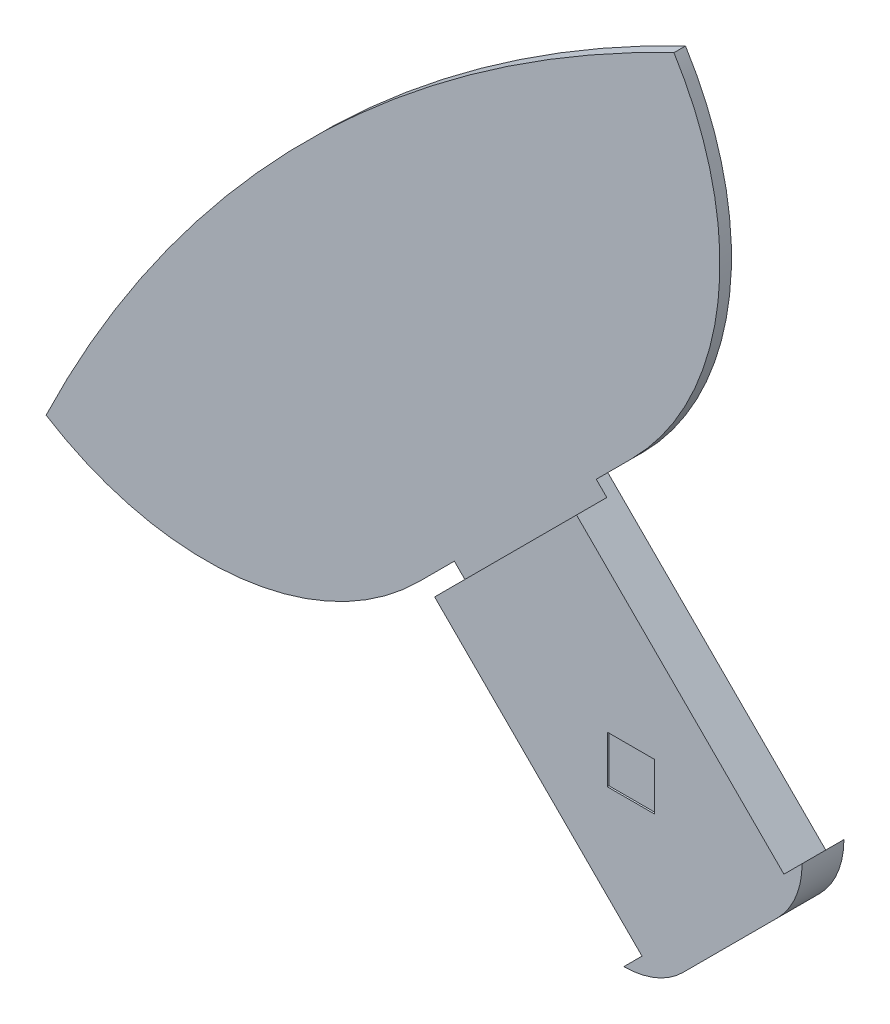
ISO-10303-21;
HEADER;
FILE_DESCRIPTION(('STEP AP214'),'2;1');
FILE_NAME('part.step','',(''),(''),'','','');
FILE_SCHEMA(('AUTOMOTIVE_DESIGN { 1 0 10303 214 1 1 1 1 }'));
ENDSEC;
DATA;
#1=APPLICATION_CONTEXT('core data for automotive mechanical design processes');
#2=APPLICATION_PROTOCOL_DEFINITION('international standard','automotive_design',2000,#1);
#3=PRODUCT_CONTEXT('',#1,'mechanical');
#4=PRODUCT('Part','Part','',(#3));
#5=PRODUCT_RELATED_PRODUCT_CATEGORY('part','',(#4));
#6=PRODUCT_DEFINITION_FORMATION('','',#4);
#7=PRODUCT_DEFINITION_CONTEXT('part definition',#1,'design');
#8=PRODUCT_DEFINITION('design','',#6,#7);
#9=PRODUCT_DEFINITION_SHAPE('','',#8);
#10=(LENGTH_UNIT() NAMED_UNIT(*) SI_UNIT(.MILLI.,.METRE.));
#11=(NAMED_UNIT(*) PLANE_ANGLE_UNIT() SI_UNIT($,.RADIAN.));
#12=(NAMED_UNIT(*) SI_UNIT($,.STERADIAN.) SOLID_ANGLE_UNIT());
#13=UNCERTAINTY_MEASURE_WITH_UNIT(LENGTH_MEASURE(1.E-05),#10,'distance_accuracy_value','');
#14=(GEOMETRIC_REPRESENTATION_CONTEXT(3) GLOBAL_UNCERTAINTY_ASSIGNED_CONTEXT((#13)) GLOBAL_UNIT_ASSIGNED_CONTEXT((#10,
#11,#12)) REPRESENTATION_CONTEXT('',''));
#15=CARTESIAN_POINT('',(0.,0.,0.));
#16=DIRECTION('',(0.,0.,1.));
#17=DIRECTION('',(1.,0.,0.));
#18=AXIS2_PLACEMENT_3D('',#15,#16,#17);
#19=CARTESIAN_POINT('',(-43.4815077525087,43.4815077525089,5.));
#20=DIRECTION('',(0.707106781186545,-0.70710678118655,0.));
#21=DIRECTION('',(0.70710678118655,0.707106781186545,0.));
#22=AXIS2_PLACEMENT_3D('',#19,#20,#21);
#23=PLANE('',#22);
#24=DIRECTION('',(0.,0.,-1.));
#25=VECTOR('',#24,1.);
#26=CARTESIAN_POINT('',(-37.1175467218298,49.8454687831878,5.));
#27=LINE('',#26,#25);
#28=CARTESIAN_POINT('',(-37.1175467218298,49.8454687831878,0.689999999999997));
#29=VERTEX_POINT('',#28);
#30=CARTESIAN_POINT('',(-37.1175467218298,49.8454687831878,0.));
#31=VERTEX_POINT('',#30);
#32=EDGE_CURVE('E287',#29,#31,#27,.T.);
#33=ORIENTED_EDGE('',*,*,#32,.F.);
#34=DIRECTION('',(0.707106781186553,0.707106781186542,0.));
#35=VECTOR('',#34,1.);
#36=CARTESIAN_POINT('',(-37.1175467218298,49.8454687831878,0.689999999999997));
#37=LINE('',#36,#35);
#38=CARTESIAN_POINT('',(-39.2388670653894,47.7241484396281,0.689999999999997));
#39=VERTEX_POINT('',#38);
#40=EDGE_CURVE('E203',#39,#29,#37,.T.);
#41=ORIENTED_EDGE('',*,*,#40,.F.);
#42=DIRECTION('',(0.,0.,-1.));
#43=VECTOR('',#42,1.);
#44=CARTESIAN_POINT('',(-39.2388670653894,47.7241484396281,5.));
#45=LINE('',#44,#43);
#46=CARTESIAN_POINT('',(-39.2388670653894,47.7241484396281,0.));
#47=VERTEX_POINT('',#46);
#48=EDGE_CURVE('E289',#39,#47,#45,.T.);
#49=ORIENTED_EDGE('',*,*,#48,.T.);
#50=DIRECTION('',(-0.70710678118655,-0.707106781186545,0.));
#51=VECTOR('',#50,1.);
#52=CARTESIAN_POINT('',(-43.4815077525087,43.4815077525089,0.));
#53=LINE('',#52,#51);
#54=EDGE_CURVE('E238',#31,#47,#53,.T.);
#55=ORIENTED_EDGE('',*,*,#54,.F.);
#56=EDGE_LOOP('',(#33,#41,#49,#55));
#57=FACE_BOUND('',#56,.T.);
#58=ADVANCED_FACE('F39',(#57),#23,.T.);
#59=CARTESIAN_POINT('',(-49.8454687831876,62.5733908445456,5.));
#60=DIRECTION('',(0.,0.,-1.));
#61=DIRECTION('',(-1.,0.,0.));
#62=AXIS2_PLACEMENT_3D('',#59,#60,#61);
#63=CYLINDRICAL_SURFACE('',#62,18.);
#64=DIRECTION('',(0.,0.,-1.));
#65=VECTOR('',#64,1.);
#66=CARTESIAN_POINT('',(-34.5941198646809,72.1335349943983,5.));
#67=LINE('',#66,#65);
#68=CARTESIAN_POINT('',(-34.5941198646809,72.1335349943984,0.689999999999997));
#69=VERTEX_POINT('',#68);
#70=CARTESIAN_POINT('',(-34.5941198646809,72.1335349943983,0.));
#71=VERTEX_POINT('',#70);
#72=EDGE_CURVE('E285',#69,#71,#67,.T.);
#73=ORIENTED_EDGE('',*,*,#72,.F.);
#74=CARTESIAN_POINT('',(-49.8454687831876,62.5733908445456,0.689999999999997));
#75=DIRECTION('',(0.,0.,1.));
#76=DIRECTION('',(1.,0.,0.));
#77=AXIS2_PLACEMENT_3D('',#74,#75,#76);
#78=CIRCLE('',#77,18.);
#79=EDGE_CURVE('E205',#29,#69,#78,.T.);
#80=ORIENTED_EDGE('',*,*,#79,.F.);
#81=ORIENTED_EDGE('',*,*,#32,.T.);
#82=CARTESIAN_POINT('',(-49.8454687831876,62.5733908445456,0.));
#83=DIRECTION('',(0.,0.,1.));
#84=DIRECTION('',(1.,0.,0.));
#85=AXIS2_PLACEMENT_3D('',#82,#83,#84);
#86=CIRCLE('',#85,18.);
#87=EDGE_CURVE('E241',#71,#31,#86,.F.);
#88=ORIENTED_EDGE('',*,*,#87,.F.);
#89=EDGE_LOOP('',(#73,#80,#81,#88));
#90=FACE_BOUND('',#89,.T.);
#91=ADVANCED_FACE('F316',(#90),#63,.T.);
#92=CARTESIAN_POINT('',(-62.5733908445455,49.8454687831878,5.));
#93=DIRECTION('',(0.,0.,-1.));
#94=DIRECTION('',(-1.,0.,0.));
#95=AXIS2_PLACEMENT_3D('',#92,#93,#94);
#96=CYLINDRICAL_SURFACE('',#95,18.);
#97=DIRECTION('',(0.,0.,-1.));
#98=VECTOR('',#97,1.);
#99=CARTESIAN_POINT('',(-49.8454687831877,37.11754672183,5.));
#100=LINE('',#99,#98);
#101=CARTESIAN_POINT('',(-49.8454687831877,37.11754672183,0.689999999999997));
#102=VERTEX_POINT('',#101);
#103=CARTESIAN_POINT('',(-49.8454687831877,37.11754672183,0.));
#104=VERTEX_POINT('',#103);
#105=EDGE_CURVE('E281',#102,#104,#100,.T.);
#106=ORIENTED_EDGE('',*,*,#105,.F.);
#107=CARTESIAN_POINT('',(-62.5733908445455,49.8454687831878,0.689999999999997));
#108=DIRECTION('',(0.,0.,1.));
#109=DIRECTION('',(1.,0.,0.));
#110=AXIS2_PLACEMENT_3D('',#107,#108,#109);
#111=CIRCLE('',#110,18.);
#112=CARTESIAN_POINT('',(-72.1335349943982,34.5941198646812,0.689999999999997));
#113=VERTEX_POINT('',#112);
#114=EDGE_CURVE('E209',#113,#102,#111,.T.);
#115=ORIENTED_EDGE('',*,*,#114,.F.);
#116=DIRECTION('',(0.,0.,-1.));
#117=VECTOR('',#116,1.);
#118=CARTESIAN_POINT('',(-72.1335349943982,34.5941198646811,5.));
#119=LINE('',#118,#117);
#120=CARTESIAN_POINT('',(-72.1335349943982,34.5941198646811,0.));
#121=VERTEX_POINT('',#120);
#122=EDGE_CURVE('E283',#113,#121,#119,.T.);
#123=ORIENTED_EDGE('',*,*,#122,.T.);
#124=CARTESIAN_POINT('',(-62.5733908445455,49.8454687831878,0.));
#125=DIRECTION('',(0.,0.,1.));
#126=DIRECTION('',(1.,0.,0.));
#127=AXIS2_PLACEMENT_3D('',#124,#125,#126);
#128=CIRCLE('',#127,18.);
#129=EDGE_CURVE('E248',#104,#121,#128,.F.);
#130=ORIENTED_EDGE('',*,*,#129,.F.);
#131=EDGE_LOOP('',(#106,#115,#123,#130));
#132=FACE_BOUND('',#131,.T.);
#133=ADVANCED_FACE('F326',(#132),#96,.T.);
#134=DIRECTION('',(0.,0.,-1.));
#135=VECTOR('',#134,1.);
#136=CARTESIAN_POINT('',(-47.724148439628,39.2388670653896,5.));
#137=LINE('',#136,#135);
#138=CARTESIAN_POINT('',(-47.724148439628,39.2388670653896,0.689999999999997));
#139=VERTEX_POINT('',#138);
#140=CARTESIAN_POINT('',(-47.724148439628,39.2388670653896,0.));
#141=VERTEX_POINT('',#140);
#142=EDGE_CURVE('E279',#139,#141,#137,.T.);
#143=ORIENTED_EDGE('',*,*,#142,.F.);
#144=DIRECTION('',(0.707106781186549,0.707106781186546,0.));
#145=VECTOR('',#144,1.);
#146=CARTESIAN_POINT('',(-47.724148439628,39.2388670653896,0.689999999999997));
#147=LINE('',#146,#145);
#148=EDGE_CURVE('E211',#102,#139,#147,.T.);
#149=ORIENTED_EDGE('',*,*,#148,.F.);
#150=ORIENTED_EDGE('',*,*,#105,.T.);
#151=EDGE_CURVE('E242',#141,#104,#53,.T.);
#152=ORIENTED_EDGE('',*,*,#151,.F.);
#153=EDGE_LOOP('',(#143,#149,#150,#152));
#154=FACE_BOUND('',#153,.T.);
#155=ADVANCED_FACE('F329',(#154),#23,.T.);
#156=CARTESIAN_POINT('',(0.,0.,5.));
#157=DIRECTION('',(0.,0.,-1.));
#158=DIRECTION('',(-1.,0.,0.));
#159=AXIS2_PLACEMENT_3D('',#156,#157,#158);
#160=CYLINDRICAL_SURFACE('',#159,80.);
#161=CARTESIAN_POINT('',(0.,0.,0.689999999999997));
#162=DIRECTION('',(0.,0.,1.));
#163=DIRECTION('',(1.,0.,0.));
#164=AXIS2_PLACEMENT_3D('',#161,#162,#163);
#165=CIRCLE('',#164,80.);
#166=EDGE_CURVE('E207',#69,#113,#165,.T.);
#167=ORIENTED_EDGE('',*,*,#166,.F.);
#168=ORIENTED_EDGE('',*,*,#72,.T.);
#169=CARTESIAN_POINT('',(0.,0.,0.));
#170=DIRECTION('',(0.,0.,1.));
#171=DIRECTION('',(1.,0.,0.));
#172=AXIS2_PLACEMENT_3D('',#169,#170,#171);
#173=CIRCLE('',#172,80.);
#174=EDGE_CURVE('E245',#71,#121,#173,.T.);
#175=ORIENTED_EDGE('',*,*,#174,.T.);
#176=ORIENTED_EDGE('',*,*,#122,.F.);
#177=EDGE_LOOP('',(#167,#168,#175,#176));
#178=FACE_BOUND('',#177,.T.);
#179=ADVANCED_FACE('F321',(#178),#160,.T.);
#180=CARTESIAN_POINT('',(4.24264068711934,4.24264068711934,5.));
#181=DIRECTION('',(0.707106781186548,0.707106781186548,0.));
#182=DIRECTION('',(-0.707106781186548,0.707106781186548,0.));
#183=AXIS2_PLACEMENT_3D('',#180,#181,#182);
#184=PLANE('',#183);
#185=DIRECTION('',(-0.707106781186551,0.707106781186544,0.));
#186=VECTOR('',#185,1.);
#187=CARTESIAN_POINT('',(-39.2388670653894,47.7241484396281,0.689999999999997));
#188=LINE('',#187,#186);
#189=CARTESIAN_POINT('',(-38.6080302527855,47.0933116270241,0.689999999999997));
#190=VERTEX_POINT('',#189);
#191=EDGE_CURVE('E198',#190,#39,#188,.T.);
#192=ORIENTED_EDGE('',*,*,#191,.F.);
#193=DIRECTION('',(0.,0.,-1.));
#194=VECTOR('',#193,1.);
#195=CARTESIAN_POINT('',(-38.6080302527855,47.0933116270241,5.));
#196=LINE('',#195,#194);
#197=CARTESIAN_POINT('',(-38.6080302527855,47.0933116270241,2.5));
#198=VERTEX_POINT('',#197);
#199=EDGE_CURVE('E233',#198,#190,#196,.T.);
#200=ORIENTED_EDGE('',*,*,#199,.F.);
#201=DIRECTION('',(-0.707106781186548,0.707106781186548,0.));
#202=VECTOR('',#201,1.);
#203=CARTESIAN_POINT('',(4.24264068711934,4.24264068711934,2.5));
#204=LINE('',#203,#202);
#205=CARTESIAN_POINT('',(-26.2085353161738,34.6938166904125,2.5));
#206=VERTEX_POINT('',#205);
#207=EDGE_CURVE('E62',#206,#198,#204,.T.);
#208=ORIENTED_EDGE('',*,*,#207,.F.);
#209=DIRECTION('',(0.,0.,-1.));
#210=VECTOR('',#209,1.);
#211=CARTESIAN_POINT('',(-26.2085353161738,34.6938166904125,5.));
#212=LINE('',#211,#210);
#213=CARTESIAN_POINT('',(-26.2085353161738,34.6938166904125,0.));
#214=VERTEX_POINT('',#213);
#215=EDGE_CURVE('E267',#206,#214,#212,.T.);
#216=ORIENTED_EDGE('',*,*,#215,.T.);
#217=DIRECTION('',(0.707106781186548,-0.707106781186548,0.));
#218=VECTOR('',#217,1.);
#219=CARTESIAN_POINT('',(4.24264068711934,4.24264068711934,0.));
#220=LINE('',#219,#218);
#221=EDGE_CURVE('E235',#47,#214,#220,.T.);
#222=ORIENTED_EDGE('',*,*,#221,.F.);
#223=ORIENTED_EDGE('',*,*,#48,.F.);
#224=EDGE_LOOP('',(#192,#200,#208,#216,#222,#223));
#225=FACE_BOUND('',#224,.T.);
#226=ADVANCED_FACE('F41',(#225),#184,.T.);
#227=CARTESIAN_POINT('',(-4.2426406871192,-4.2426406871192,5.));
#228=DIRECTION('',(0.707106781186547,0.707106781186548,0.));
#229=DIRECTION('',(-0.707106781186548,0.707106781186547,0.));
#230=AXIS2_PLACEMENT_3D('',#227,#228,#229);
#231=PLANE('',#230);
#232=DIRECTION('',(0.,0.,-1.));
#233=VECTOR('',#232,1.);
#234=CARTESIAN_POINT('',(-47.093311627024,38.6080302527856,5.));
#235=LINE('',#234,#233);
#236=CARTESIAN_POINT('',(-47.093311627024,38.6080302527856,2.5));
#237=VERTEX_POINT('',#236);
#238=CARTESIAN_POINT('',(-47.093311627024,38.6080302527856,0.689999999999997));
#239=VERTEX_POINT('',#238);
#240=EDGE_CURVE('E47',#237,#239,#235,.T.);
#241=ORIENTED_EDGE('',*,*,#240,.T.);
#242=DIRECTION('',(0.707106781186544,-0.707106781186551,0.));
#243=VECTOR('',#242,1.);
#244=CARTESIAN_POINT('',(-47.724148439628,39.2388670653896,0.689999999999997));
#245=LINE('',#244,#243);
#246=EDGE_CURVE('E213',#139,#239,#245,.T.);
#247=ORIENTED_EDGE('',*,*,#246,.F.);
#248=ORIENTED_EDGE('',*,*,#142,.T.);
#249=DIRECTION('',(0.707106781186548,-0.707106781186547,0.));
#250=VECTOR('',#249,1.);
#251=CARTESIAN_POINT('',(-4.2426406871192,-4.2426406871192,0.));
#252=LINE('',#251,#250);
#253=CARTESIAN_POINT('',(-34.6938166904123,26.2085353161739,0.));
#254=VERTEX_POINT('',#253);
#255=EDGE_CURVE('E251',#141,#254,#252,.T.);
#256=ORIENTED_EDGE('',*,*,#255,.T.);
#257=DIRECTION('',(0.,0.,-1.));
#258=VECTOR('',#257,1.);
#259=CARTESIAN_POINT('',(-34.6938166904123,26.2085353161739,5.));
#260=LINE('',#259,#258);
#261=CARTESIAN_POINT('',(-34.6938166904123,26.2085353161739,2.5));
#262=VERTEX_POINT('',#261);
#263=EDGE_CURVE('E277',#262,#254,#260,.T.);
#264=ORIENTED_EDGE('',*,*,#263,.F.);
#265=DIRECTION('',(-0.707106781186548,0.707106781186547,0.));
#266=VECTOR('',#265,1.);
#267=CARTESIAN_POINT('',(-4.2426406871192,-4.2426406871192,2.5));
#268=LINE('',#267,#266);
#269=EDGE_CURVE('E219',#262,#237,#268,.T.);
#270=ORIENTED_EDGE('',*,*,#269,.T.);
#271=EDGE_LOOP('',(#241,#247,#248,#256,#264,#270));
#272=FACE_BOUND('',#271,.T.);
#273=ADVANCED_FACE('F293',(#272),#231,.F.);
#274=CARTESIAN_POINT('',(-30.4511760032931,30.4511760032932,5.));
#275=DIRECTION('',(-0.707106781186546,0.707106781186549,0.));
#276=DIRECTION('',(-0.707106781186549,-0.707106781186546,0.));
#277=AXIS2_PLACEMENT_3D('',#274,#275,#276);
#278=PLANE('',#277);
#279=DIRECTION('',(-0.707106781186549,-0.707106781186546,0.));
#280=VECTOR('',#279,1.);
#281=CARTESIAN_POINT('',(-30.4511760032931,30.4511760032932,2.5));
#282=LINE('',#281,#280);
#283=CARTESIAN_POINT('',(-35.7796031280393,25.122748878547,2.5));
#284=VERTEX_POINT('',#283);
#285=EDGE_CURVE('E231',#262,#284,#282,.T.);
#286=ORIENTED_EDGE('',*,*,#285,.F.);
#287=ORIENTED_EDGE('',*,*,#263,.T.);
#288=DIRECTION('',(0.707106781186549,0.707106781186546,0.));
#289=VECTOR('',#288,1.);
#290=CARTESIAN_POINT('',(-30.4511760032931,30.4511760032932,0.));
#291=LINE('',#290,#289);
#292=CARTESIAN_POINT('',(-35.7796031280393,25.122748878547,0.));
#293=VERTEX_POINT('',#292);
#294=EDGE_CURVE('E254',#293,#254,#291,.T.);
#295=ORIENTED_EDGE('',*,*,#294,.F.);
#296=DIRECTION('',(0.,0.,-1.));
#297=VECTOR('',#296,1.);
#298=CARTESIAN_POINT('',(-35.7796031280393,25.122748878547,5.));
#299=LINE('',#298,#297);
#300=EDGE_CURVE('E275',#284,#293,#299,.T.);
#301=ORIENTED_EDGE('',*,*,#300,.F.);
#302=EDGE_LOOP('',(#286,#287,#295,#301));
#303=FACE_BOUND('',#302,.T.);
#304=ADVANCED_FACE('F339',(#303),#278,.T.);
#305=CARTESIAN_POINT('',(-35.7796031280392,30.122748878547,5.));
#306=DIRECTION('',(0.,0.,-1.));
#307=DIRECTION('',(-1.,0.,0.));
#308=AXIS2_PLACEMENT_3D('',#305,#306,#307);
#309=CYLINDRICAL_SURFACE('',#308,5.);
#310=CARTESIAN_POINT('',(-35.7796031280392,30.122748878547,2.5));
#311=DIRECTION('',(0.,0.,-1.));
#312=DIRECTION('',(-1.,0.,0.));
#313=AXIS2_PLACEMENT_3D('',#310,#311,#312);
#314=CIRCLE('',#313,5.);
#315=CARTESIAN_POINT('',(-32.2440692221065,26.5872149726143,2.5));
#316=VERTEX_POINT('',#315);
#317=EDGE_CURVE('E229',#284,#316,#314,.F.);
#318=ORIENTED_EDGE('',*,*,#317,.F.);
#319=ORIENTED_EDGE('',*,*,#300,.T.);
#320=CARTESIAN_POINT('',(-35.7796031280392,30.122748878547,0.));
#321=DIRECTION('',(0.,0.,1.));
#322=DIRECTION('',(1.,0.,0.));
#323=AXIS2_PLACEMENT_3D('',#320,#321,#322);
#324=CIRCLE('',#323,5.);
#325=CARTESIAN_POINT('',(-32.2440692221065,26.5872149726143,0.));
#326=VERTEX_POINT('',#325);
#327=EDGE_CURVE('E257',#326,#293,#324,.F.);
#328=ORIENTED_EDGE('',*,*,#327,.F.);
#329=DIRECTION('',(0.,0.,-1.));
#330=VECTOR('',#329,1.);
#331=CARTESIAN_POINT('',(-32.2440692221065,26.5872149726143,5.));
#332=LINE('',#331,#330);
#333=EDGE_CURVE('E273',#316,#326,#332,.T.);
#334=ORIENTED_EDGE('',*,*,#333,.F.);
#335=EDGE_LOOP('',(#318,#319,#328,#334));
#336=FACE_BOUND('',#335,.T.);
#337=ADVANCED_FACE('F345',(#336),#309,.T.);
#338=CARTESIAN_POINT('',(-29.4156420973603,29.4156420973604,5.));
#339=DIRECTION('',(0.707106781186546,-0.707106781186549,0.));
#340=DIRECTION('',(0.707106781186549,0.707106781186546,0.));
#341=AXIS2_PLACEMENT_3D('',#338,#339,#340);
#342=PLANE('',#341);
#343=DIRECTION('',(0.707106781186549,0.707106781186546,0.));
#344=VECTOR('',#343,1.);
#345=CARTESIAN_POINT('',(-29.4156420973603,29.4156420973604,2.5));
#346=LINE('',#345,#344);
#347=CARTESIAN_POINT('',(-26.5872149726142,32.2440692221066,2.5));
#348=VERTEX_POINT('',#347);
#349=EDGE_CURVE('E227',#316,#348,#346,.T.);
#350=ORIENTED_EDGE('',*,*,#349,.F.);
#351=ORIENTED_EDGE('',*,*,#333,.T.);
#352=DIRECTION('',(-0.707106781186549,-0.707106781186546,0.));
#353=VECTOR('',#352,1.);
#354=CARTESIAN_POINT('',(-29.4156420973603,29.4156420973604,0.));
#355=LINE('',#354,#353);
#356=CARTESIAN_POINT('',(-26.5872149726142,32.2440692221066,0.));
#357=VERTEX_POINT('',#356);
#358=EDGE_CURVE('E261',#357,#326,#355,.T.);
#359=ORIENTED_EDGE('',*,*,#358,.F.);
#360=DIRECTION('',(0.,0.,-1.));
#361=VECTOR('',#360,1.);
#362=CARTESIAN_POINT('',(-26.5872149726142,32.2440692221066,5.));
#363=LINE('',#362,#361);
#364=EDGE_CURVE('E271',#348,#357,#363,.T.);
#365=ORIENTED_EDGE('',*,*,#364,.F.);
#366=EDGE_LOOP('',(#350,#351,#359,#365));
#367=FACE_BOUND('',#366,.T.);
#368=ADVANCED_FACE('F348',(#367),#342,.T.);
#369=CARTESIAN_POINT('',(-30.1227488785469,35.7796031280394,5.));
#370=DIRECTION('',(0.,0.,-1.));
#371=DIRECTION('',(-1.,0.,0.));
#372=AXIS2_PLACEMENT_3D('',#369,#370,#371);
#373=CYLINDRICAL_SURFACE('',#372,5.);
#374=CARTESIAN_POINT('',(-30.1227488785469,35.7796031280394,2.5));
#375=DIRECTION('',(0.,0.,-1.));
#376=DIRECTION('',(-1.,0.,0.));
#377=AXIS2_PLACEMENT_3D('',#374,#375,#376);
#378=CIRCLE('',#377,5.);
#379=CARTESIAN_POINT('',(-25.1227488785469,35.7796031280393,2.5));
#380=VERTEX_POINT('',#379);
#381=EDGE_CURVE('E225',#348,#380,#378,.F.);
#382=ORIENTED_EDGE('',*,*,#381,.F.);
#383=ORIENTED_EDGE('',*,*,#364,.T.);
#384=CARTESIAN_POINT('',(-30.1227488785469,35.7796031280394,0.));
#385=DIRECTION('',(0.,0.,1.));
#386=DIRECTION('',(1.,0.,0.));
#387=AXIS2_PLACEMENT_3D('',#384,#385,#386);
#388=CIRCLE('',#387,5.);
#389=CARTESIAN_POINT('',(-25.1227488785469,35.7796031280393,0.));
#390=VERTEX_POINT('',#389);
#391=EDGE_CURVE('E264',#390,#357,#388,.F.);
#392=ORIENTED_EDGE('',*,*,#391,.F.);
#393=DIRECTION('',(0.,0.,-1.));
#394=VECTOR('',#393,1.);
#395=CARTESIAN_POINT('',(-25.1227488785469,35.7796031280393,5.));
#396=LINE('',#395,#394);
#397=EDGE_CURVE('E269',#380,#390,#396,.T.);
#398=ORIENTED_EDGE('',*,*,#397,.F.);
#399=EDGE_LOOP('',(#382,#383,#392,#398));
#400=FACE_BOUND('',#399,.T.);
#401=ADVANCED_FACE('F354',(#400),#373,.T.);
#402=DIRECTION('',(-0.707106781186549,-0.707106781186546,0.));
#403=VECTOR('',#402,1.);
#404=CARTESIAN_POINT('',(-30.4511760032931,30.4511760032932,2.5));
#405=LINE('',#404,#403);
#406=EDGE_CURVE('E223',#380,#206,#405,.T.);
#407=ORIENTED_EDGE('',*,*,#406,.F.);
#408=ORIENTED_EDGE('',*,*,#397,.T.);
#409=EDGE_CURVE('E258',#214,#390,#291,.T.);
#410=ORIENTED_EDGE('',*,*,#409,.F.);
#411=ORIENTED_EDGE('',*,*,#215,.F.);
#412=EDGE_LOOP('',(#407,#408,#410,#411));
#413=FACE_BOUND('',#412,.T.);
#414=ADVANCED_FACE('F359',(#413),#278,.T.);
#415=CARTESIAN_POINT('',(0.,0.,0.));
#416=DIRECTION('',(0.,0.,1.));
#417=DIRECTION('',(1.,0.,0.));
#418=AXIS2_PLACEMENT_3D('',#415,#416,#417);
#419=PLANE('',#418);
#420=ORIENTED_EDGE('',*,*,#221,.T.);
#421=ORIENTED_EDGE('',*,*,#409,.T.);
#422=ORIENTED_EDGE('',*,*,#391,.T.);
#423=ORIENTED_EDGE('',*,*,#358,.T.);
#424=ORIENTED_EDGE('',*,*,#327,.T.);
#425=ORIENTED_EDGE('',*,*,#294,.T.);
#426=ORIENTED_EDGE('',*,*,#255,.F.);
#427=ORIENTED_EDGE('',*,*,#151,.T.);
#428=ORIENTED_EDGE('',*,*,#129,.T.);
#429=ORIENTED_EDGE('',*,*,#174,.F.);
#430=ORIENTED_EDGE('',*,*,#87,.T.);
#431=ORIENTED_EDGE('',*,*,#54,.T.);
#432=EDGE_LOOP('',(#420,#421,#422,#423,#424,#425,#426,#427,#428,#429,#430,#431));
#433=FACE_BOUND('',#432,.T.);
#434=ADVANCED_FACE('F333',(#433),#419,.F.);
#435=CARTESIAN_POINT('',(-42.8506709399047,42.8506709399049,0.));
#436=DIRECTION('',(0.707106781186546,-0.707106781186549,0.));
#437=DIRECTION('',(0.707106781186549,0.707106781186546,0.));
#438=AXIS2_PLACEMENT_3D('',#435,#436,#437);
#439=PLANE('',#438);
#440=ORIENTED_EDGE('',*,*,#240,.F.);
#441=DIRECTION('',(0.707106781186549,0.707106781186546,0.));
#442=VECTOR('',#441,1.);
#443=CARTESIAN_POINT('',(-42.8506709399047,42.8506709399049,2.5));
#444=LINE('',#443,#442);
#445=EDGE_CURVE('E11',#237,#198,#444,.T.);
#446=ORIENTED_EDGE('',*,*,#445,.T.);
#447=ORIENTED_EDGE('',*,*,#199,.T.);
#448=DIRECTION('',(0.707106781186549,0.707106781186546,0.));
#449=VECTOR('',#448,1.);
#450=CARTESIAN_POINT('',(-47.093311627024,38.6080302527856,0.689999999999997));
#451=LINE('',#450,#449);
#452=EDGE_CURVE('E216',#239,#190,#451,.T.);
#453=ORIENTED_EDGE('',*,*,#452,.F.);
#454=EDGE_LOOP('',(#440,#446,#447,#453));
#455=FACE_BOUND('',#454,.T.);
#456=ADVANCED_FACE('F302',(#455),#439,.F.);
#457=CARTESIAN_POINT('',(-20.9303607231218,20.9303607231219,2.5));
#458=DIRECTION('',(0.,0.,-1.));
#459=DIRECTION('',(-1.,0.,0.));
#460=AXIS2_PLACEMENT_3D('',#457,#458,#459);
#461=PLANE('',#460);
#462=DIRECTION('',(-1.,0.,0.));
#463=VECTOR('',#462,1.);
#464=CARTESIAN_POINT('',(-33.9411254969542,36.7695526217005,2.5));
#465=LINE('',#464,#463);
#466=CARTESIAN_POINT('',(-33.9411254969542,36.7695526217005,2.5));
#467=VERTEX_POINT('',#466);
#468=CARTESIAN_POINT('',(-36.7695526217004,36.7695526217005,2.5));
#469=VERTEX_POINT('',#468);
#470=EDGE_CURVE('E192',#467,#469,#465,.T.);
#471=ORIENTED_EDGE('',*,*,#470,.F.);
#472=DIRECTION('',(0.,1.,0.));
#473=VECTOR('',#472,1.);
#474=CARTESIAN_POINT('',(-33.9411254969542,33.9411254969543,2.5));
#475=LINE('',#474,#473);
#476=CARTESIAN_POINT('',(-33.9411254969542,33.9411254969543,2.5));
#477=VERTEX_POINT('',#476);
#478=EDGE_CURVE('E54',#477,#467,#475,.T.);
#479=ORIENTED_EDGE('',*,*,#478,.F.);
#480=DIRECTION('',(1.,0.,0.));
#481=VECTOR('',#480,1.);
#482=CARTESIAN_POINT('',(-33.9411254969542,33.9411254969543,2.5));
#483=LINE('',#482,#481);
#484=CARTESIAN_POINT('',(-36.7695526217004,33.9411254969543,2.5));
#485=VERTEX_POINT('',#484);
#486=EDGE_CURVE('E183',#485,#477,#483,.T.);
#487=ORIENTED_EDGE('',*,*,#486,.F.);
#488=DIRECTION('',(0.,-1.,0.));
#489=VECTOR('',#488,1.);
#490=CARTESIAN_POINT('',(-36.7695526217004,33.9411254969543,2.5));
#491=LINE('',#490,#489);
#492=EDGE_CURVE('E186',#469,#485,#491,.T.);
#493=ORIENTED_EDGE('',*,*,#492,.F.);
#494=EDGE_LOOP('',(#471,#479,#487,#493));
#495=FACE_BOUND('',#494,.T.);
#496=ORIENTED_EDGE('',*,*,#285,.T.);
#497=ORIENTED_EDGE('',*,*,#317,.T.);
#498=ORIENTED_EDGE('',*,*,#349,.T.);
#499=ORIENTED_EDGE('',*,*,#381,.T.);
#500=ORIENTED_EDGE('',*,*,#406,.T.);
#501=ORIENTED_EDGE('',*,*,#207,.T.);
#502=ORIENTED_EDGE('',*,*,#445,.F.);
#503=ORIENTED_EDGE('',*,*,#269,.F.);
#504=EDGE_LOOP('',(#496,#497,#498,#499,#500,#501,#502,#503));
#505=FACE_BOUND('',#504,.T.);
#506=ADVANCED_FACE('F341',(#495,#505),#461,.F.);
#507=CARTESIAN_POINT('',(-62.5733908445455,49.8454687831878,0.689999999999997));
#508=DIRECTION('',(0.,0.,1.));
#509=DIRECTION('',(1.,0.,0.));
#510=AXIS2_PLACEMENT_3D('',#507,#508,#509);
#511=PLANE('',#510);
#512=ORIENTED_EDGE('',*,*,#191,.T.);
#513=ORIENTED_EDGE('',*,*,#40,.T.);
#514=ORIENTED_EDGE('',*,*,#79,.T.);
#515=ORIENTED_EDGE('',*,*,#166,.T.);
#516=ORIENTED_EDGE('',*,*,#114,.T.);
#517=ORIENTED_EDGE('',*,*,#148,.T.);
#518=ORIENTED_EDGE('',*,*,#246,.T.);
#519=ORIENTED_EDGE('',*,*,#452,.T.);
#520=EDGE_LOOP('',(#512,#513,#514,#515,#516,#517,#518,#519));
#521=FACE_BOUND('',#520,.T.);
#522=ADVANCED_FACE('F299',(#521),#511,.T.);
#523=CARTESIAN_POINT('',(-33.9411254969542,33.9411254969543,2.4));
#524=DIRECTION('',(1.,0.,0.));
#525=DIRECTION('',(0.,0.,-1.));
#526=AXIS2_PLACEMENT_3D('',#523,#524,#525);
#527=PLANE('',#526);
#528=ORIENTED_EDGE('',*,*,#478,.T.);
#529=DIRECTION('',(0.,0.,1.));
#530=VECTOR('',#529,1.);
#531=CARTESIAN_POINT('',(-33.9411254969542,36.7695526217005,2.4));
#532=LINE('',#531,#530);
#533=CARTESIAN_POINT('',(-33.9411254969542,36.7695526217005,2.4));
#534=VERTEX_POINT('',#533);
#535=EDGE_CURVE('E161',#534,#467,#532,.T.);
#536=ORIENTED_EDGE('',*,*,#535,.F.);
#537=DIRECTION('',(0.,1.,0.));
#538=VECTOR('',#537,1.);
#539=CARTESIAN_POINT('',(-33.9411254969542,33.9411254969543,2.4));
#540=LINE('',#539,#538);
#541=CARTESIAN_POINT('',(-33.9411254969542,33.9411254969543,2.4));
#542=VERTEX_POINT('',#541);
#543=EDGE_CURVE('E165',#542,#534,#540,.T.);
#544=ORIENTED_EDGE('',*,*,#543,.F.);
#545=DIRECTION('',(0.,0.,1.));
#546=VECTOR('',#545,1.);
#547=CARTESIAN_POINT('',(-33.9411254969542,33.9411254969543,2.4));
#548=LINE('',#547,#546);
#549=EDGE_CURVE('E196',#542,#477,#548,.T.);
#550=ORIENTED_EDGE('',*,*,#549,.T.);
#551=EDGE_LOOP('',(#528,#536,#544,#550));
#552=FACE_BOUND('',#551,.T.);
#553=ADVANCED_FACE('F163',(#552),#527,.F.);
#554=CARTESIAN_POINT('',(-33.9411254969542,33.9411254969543,2.4));
#555=DIRECTION('',(0.,-1.,0.));
#556=DIRECTION('',(0.,0.,-1.));
#557=AXIS2_PLACEMENT_3D('',#554,#555,#556);
#558=PLANE('',#557);
#559=ORIENTED_EDGE('',*,*,#486,.T.);
#560=ORIENTED_EDGE('',*,*,#549,.F.);
#561=DIRECTION('',(1.,0.,0.));
#562=VECTOR('',#561,1.);
#563=CARTESIAN_POINT('',(-33.9411254969542,33.9411254969543,2.4));
#564=LINE('',#563,#562);
#565=CARTESIAN_POINT('',(-36.7695526217004,33.9411254969543,2.4));
#566=VERTEX_POINT('',#565);
#567=EDGE_CURVE('E171',#566,#542,#564,.T.);
#568=ORIENTED_EDGE('',*,*,#567,.F.);
#569=DIRECTION('',(0.,0.,1.));
#570=VECTOR('',#569,1.);
#571=CARTESIAN_POINT('',(-36.7695526217004,33.9411254969543,2.4));
#572=LINE('',#571,#570);
#573=EDGE_CURVE('E199',#566,#485,#572,.T.);
#574=ORIENTED_EDGE('',*,*,#573,.T.);
#575=EDGE_LOOP('',(#559,#560,#568,#574));
#576=FACE_BOUND('',#575,.T.);
#577=ADVANCED_FACE('F416',(#576),#558,.F.);
#578=CARTESIAN_POINT('',(-36.7695526217004,33.9411254969543,2.4));
#579=DIRECTION('',(-1.,0.,0.));
#580=DIRECTION('',(0.,0.,1.));
#581=AXIS2_PLACEMENT_3D('',#578,#579,#580);
#582=PLANE('',#581);
#583=ORIENTED_EDGE('',*,*,#492,.T.);
#584=ORIENTED_EDGE('',*,*,#573,.F.);
#585=DIRECTION('',(0.,-1.,0.));
#586=VECTOR('',#585,1.);
#587=CARTESIAN_POINT('',(-36.7695526217004,33.9411254969543,2.4));
#588=LINE('',#587,#586);
#589=CARTESIAN_POINT('',(-36.7695526217004,36.7695526217005,2.4));
#590=VERTEX_POINT('',#589);
#591=EDGE_CURVE('E179',#590,#566,#588,.T.);
#592=ORIENTED_EDGE('',*,*,#591,.F.);
#593=DIRECTION('',(0.,0.,1.));
#594=VECTOR('',#593,1.);
#595=CARTESIAN_POINT('',(-36.7695526217004,36.7695526217005,2.4));
#596=LINE('',#595,#594);
#597=EDGE_CURVE('E170',#590,#469,#596,.T.);
#598=ORIENTED_EDGE('',*,*,#597,.T.);
#599=EDGE_LOOP('',(#583,#584,#592,#598));
#600=FACE_BOUND('',#599,.T.);
#601=ADVANCED_FACE('F423',(#600),#582,.F.);
#602=CARTESIAN_POINT('',(-33.9411254969542,36.7695526217005,2.4));
#603=DIRECTION('',(0.,1.,0.));
#604=DIRECTION('',(0.,0.,1.));
#605=AXIS2_PLACEMENT_3D('',#602,#603,#604);
#606=PLANE('',#605);
#607=ORIENTED_EDGE('',*,*,#470,.T.);
#608=ORIENTED_EDGE('',*,*,#597,.F.);
#609=DIRECTION('',(-1.,0.,0.));
#610=VECTOR('',#609,1.);
#611=CARTESIAN_POINT('',(-33.9411254969542,36.7695526217005,2.4));
#612=LINE('',#611,#610);
#613=EDGE_CURVE('E174',#534,#590,#612,.T.);
#614=ORIENTED_EDGE('',*,*,#613,.F.);
#615=ORIENTED_EDGE('',*,*,#535,.T.);
#616=EDGE_LOOP('',(#607,#608,#614,#615));
#617=FACE_BOUND('',#616,.T.);
#618=ADVANCED_FACE('F175',(#617),#606,.F.);
#619=CARTESIAN_POINT('',(0.,0.,2.4));
#620=DIRECTION('',(0.,0.,1.));
#621=DIRECTION('',(1.,0.,0.));
#622=AXIS2_PLACEMENT_3D('',#619,#620,#621);
#623=PLANE('',#622);
#624=ORIENTED_EDGE('',*,*,#543,.T.);
#625=ORIENTED_EDGE('',*,*,#613,.T.);
#626=ORIENTED_EDGE('',*,*,#591,.T.);
#627=ORIENTED_EDGE('',*,*,#567,.T.);
#628=EDGE_LOOP('',(#624,#625,#626,#627));
#629=FACE_BOUND('',#628,.T.);
#630=ADVANCED_FACE('F181',(#629),#623,.T.);
#631=CLOSED_SHELL('',(#58,#91,#133,#155,#179,#226,#273,#304,#337,#368,#401,#414,#434,#456,#506,
#522,#553,#577,#601,#618,#630));
#632=MANIFOLD_SOLID_BREP('B2',#631);
#633=ADVANCED_BREP_SHAPE_REPRESENTATION('',(#18,#632),#14);
#634=SHAPE_DEFINITION_REPRESENTATION(#9,#633);
ENDSEC;
END-ISO-10303-21;
